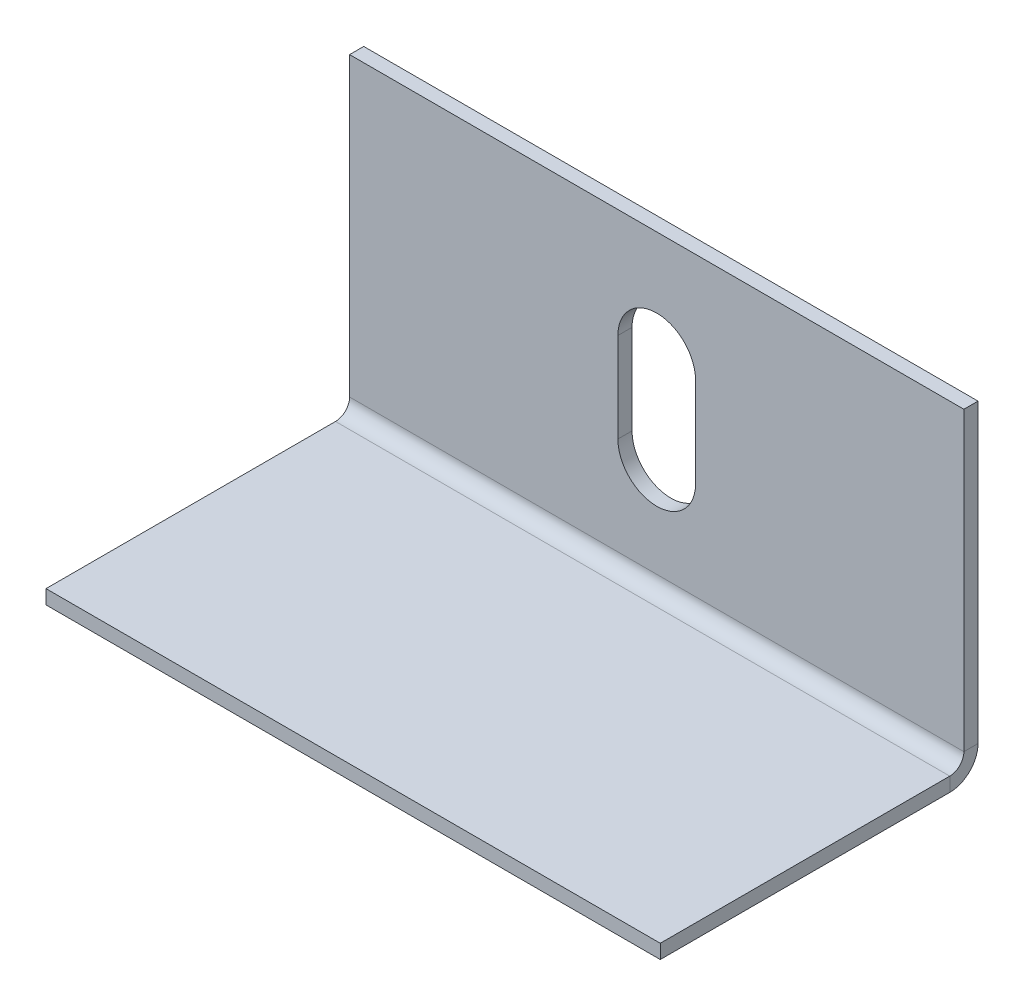
ISO-10303-21;
HEADER;
FILE_DESCRIPTION(('STEP AP214'),'2;1');
FILE_NAME('part.step','',(''),(''),'','','');
FILE_SCHEMA(('AUTOMOTIVE_DESIGN { 1 0 10303 214 1 1 1 1 }'));
ENDSEC;
DATA;
#1=APPLICATION_CONTEXT('core data for automotive mechanical design processes');
#2=APPLICATION_PROTOCOL_DEFINITION('international standard','automotive_design',2000,#1);
#3=PRODUCT_CONTEXT('',#1,'mechanical');
#4=PRODUCT('Part','Part','',(#3));
#5=PRODUCT_RELATED_PRODUCT_CATEGORY('part','',(#4));
#6=PRODUCT_DEFINITION_FORMATION('','',#4);
#7=PRODUCT_DEFINITION_CONTEXT('part definition',#1,'design');
#8=PRODUCT_DEFINITION('design','',#6,#7);
#9=PRODUCT_DEFINITION_SHAPE('','',#8);
#10=(LENGTH_UNIT() NAMED_UNIT(*) SI_UNIT(.MILLI.,.METRE.));
#11=(NAMED_UNIT(*) PLANE_ANGLE_UNIT() SI_UNIT($,.RADIAN.));
#12=(NAMED_UNIT(*) SI_UNIT($,.STERADIAN.) SOLID_ANGLE_UNIT());
#13=UNCERTAINTY_MEASURE_WITH_UNIT(LENGTH_MEASURE(1.E-05),#10,'distance_accuracy_value','');
#14=(GEOMETRIC_REPRESENTATION_CONTEXT(3) GLOBAL_UNCERTAINTY_ASSIGNED_CONTEXT((#13)) GLOBAL_UNIT_ASSIGNED_CONTEXT((#10,
#11,#12)) REPRESENTATION_CONTEXT('',''));
#15=CARTESIAN_POINT('',(0.,0.,0.));
#16=DIRECTION('',(0.,0.,1.));
#17=DIRECTION('',(1.,0.,0.));
#18=AXIS2_PLACEMENT_3D('',#15,#16,#17);
#19=CARTESIAN_POINT('',(-43.5,-2.,21.5));
#20=DIRECTION('',(-1.,0.,0.));
#21=DIRECTION('',(0.,0.,1.));
#22=AXIS2_PLACEMENT_3D('',#19,#20,#21);
#23=PLANE('',#22);
#24=DIRECTION('',(0.,0.,1.));
#25=VECTOR('',#24,1.);
#26=CARTESIAN_POINT('',(-43.5,0.,21.5));
#27=LINE('',#26,#25);
#28=CARTESIAN_POINT('',(-43.5,0.,-19.5));
#29=VERTEX_POINT('',#28);
#30=CARTESIAN_POINT('',(-43.5,0.,21.5));
#31=VERTEX_POINT('',#30);
#32=EDGE_CURVE('E221',#29,#31,#27,.T.);
#33=ORIENTED_EDGE('',*,*,#32,.F.);
#34=DIRECTION('',(0.,-1.,0.));
#35=VECTOR('',#34,1.);
#36=CARTESIAN_POINT('',(-43.5,0.,-19.5));
#37=LINE('',#36,#35);
#38=CARTESIAN_POINT('',(-43.5,-2.00000000000001,-19.5));
#39=VERTEX_POINT('',#38);
#40=EDGE_CURVE('E193',#29,#39,#37,.T.);
#41=ORIENTED_EDGE('',*,*,#40,.T.);
#42=DIRECTION('',(0.,0.,1.));
#43=VECTOR('',#42,1.);
#44=CARTESIAN_POINT('',(-43.5,-2.,21.5));
#45=LINE('',#44,#43);
#46=CARTESIAN_POINT('',(-43.5,-2.,21.5));
#47=VERTEX_POINT('',#46);
#48=EDGE_CURVE('E212',#39,#47,#45,.T.);
#49=ORIENTED_EDGE('',*,*,#48,.T.);
#50=DIRECTION('',(0.,1.,0.));
#51=VECTOR('',#50,1.);
#52=CARTESIAN_POINT('',(-43.5,-2.,21.5));
#53=LINE('',#52,#51);
#54=EDGE_CURVE('E218',#47,#31,#53,.T.);
#55=ORIENTED_EDGE('',*,*,#54,.T.);
#56=EDGE_LOOP('',(#33,#41,#49,#55));
#57=FACE_BOUND('',#56,.T.);
#58=ADVANCED_FACE('F39',(#57),#23,.T.);
#59=CARTESIAN_POINT('',(0.,-2.,0.));
#60=DIRECTION('',(0.,-1.,0.));
#61=DIRECTION('',(0.,0.,-1.));
#62=AXIS2_PLACEMENT_3D('',#59,#60,#61);
#63=PLANE('',#62);
#64=ORIENTED_EDGE('',*,*,#48,.F.);
#65=DIRECTION('',(-1.,0.,0.));
#66=VECTOR('',#65,1.);
#67=CARTESIAN_POINT('',(-43.5,-2.00000000000001,-19.5));
#68=LINE('',#67,#66);
#69=CARTESIAN_POINT('',(43.5,-2.,-19.5));
#70=VERTEX_POINT('',#69);
#71=EDGE_CURVE('E186',#39,#70,#68,.F.);
#72=ORIENTED_EDGE('',*,*,#71,.T.);
#73=DIRECTION('',(0.,0.,-1.));
#74=VECTOR('',#73,1.);
#75=CARTESIAN_POINT('',(43.5,-2.,21.5));
#76=LINE('',#75,#74);
#77=CARTESIAN_POINT('',(43.5,-2.,21.5));
#78=VERTEX_POINT('',#77);
#79=EDGE_CURVE('E209',#78,#70,#76,.T.);
#80=ORIENTED_EDGE('',*,*,#79,.F.);
#81=DIRECTION('',(1.,0.,0.));
#82=VECTOR('',#81,1.);
#83=CARTESIAN_POINT('',(-43.5,-2.,21.5));
#84=LINE('',#83,#82);
#85=EDGE_CURVE('E215',#47,#78,#84,.T.);
#86=ORIENTED_EDGE('',*,*,#85,.F.);
#87=EDGE_LOOP('',(#64,#72,#80,#86));
#88=FACE_BOUND('',#87,.T.);
#89=ADVANCED_FACE('F253',(#88),#63,.T.);
#90=CARTESIAN_POINT('',(0.,0.,0.));
#91=DIRECTION('',(0.,-1.,0.));
#92=DIRECTION('',(0.,0.,-1.));
#93=AXIS2_PLACEMENT_3D('',#90,#91,#92);
#94=PLANE('',#93);
#95=DIRECTION('',(-1.,0.,0.));
#96=VECTOR('',#95,1.);
#97=CARTESIAN_POINT('',(-43.5,0.,-19.5));
#98=LINE('',#97,#96);
#99=CARTESIAN_POINT('',(43.5,0.,-19.5));
#100=VERTEX_POINT('',#99);
#101=EDGE_CURVE('E199',#29,#100,#98,.F.);
#102=ORIENTED_EDGE('',*,*,#101,.F.);
#103=ORIENTED_EDGE('',*,*,#32,.T.);
#104=DIRECTION('',(1.,0.,0.));
#105=VECTOR('',#104,1.);
#106=CARTESIAN_POINT('',(-43.5,0.,21.5));
#107=LINE('',#106,#105);
#108=CARTESIAN_POINT('',(43.5,0.,21.5));
#109=VERTEX_POINT('',#108);
#110=EDGE_CURVE('E213',#31,#109,#107,.T.);
#111=ORIENTED_EDGE('',*,*,#110,.T.);
#112=DIRECTION('',(0.,0.,-1.));
#113=VECTOR('',#112,1.);
#114=CARTESIAN_POINT('',(43.5,0.,21.5));
#115=LINE('',#114,#113);
#116=EDGE_CURVE('E206',#109,#100,#115,.T.);
#117=ORIENTED_EDGE('',*,*,#116,.T.);
#118=EDGE_LOOP('',(#102,#103,#111,#117));
#119=FACE_BOUND('',#118,.T.);
#120=ADVANCED_FACE('F258',(#119),#94,.F.);
#121=CARTESIAN_POINT('',(43.5,-2.,21.5));
#122=DIRECTION('',(1.,0.,0.));
#123=DIRECTION('',(0.,0.,-1.));
#124=AXIS2_PLACEMENT_3D('',#121,#122,#123);
#125=PLANE('',#124);
#126=DIRECTION('',(0.,-1.,0.));
#127=VECTOR('',#126,1.);
#128=CARTESIAN_POINT('',(43.5,0.,-19.5));
#129=LINE('',#128,#127);
#130=EDGE_CURVE('E203',#100,#70,#129,.T.);
#131=ORIENTED_EDGE('',*,*,#130,.F.);
#132=ORIENTED_EDGE('',*,*,#116,.F.);
#133=DIRECTION('',(0.,1.,0.));
#134=VECTOR('',#133,1.);
#135=CARTESIAN_POINT('',(43.5,-2.,21.5));
#136=LINE('',#135,#134);
#137=EDGE_CURVE('E225',#78,#109,#136,.T.);
#138=ORIENTED_EDGE('',*,*,#137,.F.);
#139=ORIENTED_EDGE('',*,*,#79,.T.);
#140=EDGE_LOOP('',(#131,#132,#138,#139));
#141=FACE_BOUND('',#140,.T.);
#142=ADVANCED_FACE('F41',(#141),#125,.T.);
#143=CARTESIAN_POINT('',(-43.5,-2.,21.5));
#144=DIRECTION('',(0.,0.,1.));
#145=DIRECTION('',(1.,0.,0.));
#146=AXIS2_PLACEMENT_3D('',#143,#144,#145);
#147=PLANE('',#146);
#148=ORIENTED_EDGE('',*,*,#110,.F.);
#149=ORIENTED_EDGE('',*,*,#54,.F.);
#150=ORIENTED_EDGE('',*,*,#85,.T.);
#151=ORIENTED_EDGE('',*,*,#137,.T.);
#152=EDGE_LOOP('',(#148,#149,#150,#151));
#153=FACE_BOUND('',#152,.T.);
#154=ADVANCED_FACE('F263',(#153),#147,.T.);
#155=CARTESIAN_POINT('',(43.5,1.99999999999998,-19.5));
#156=DIRECTION('',(1.,0.,0.));
#157=DIRECTION('',(0.,1.,0.));
#158=AXIS2_PLACEMENT_3D('',#155,#156,#157);
#159=PLANE('',#158);
#160=DIRECTION('',(0.,0.,-1.));
#161=VECTOR('',#160,1.);
#162=CARTESIAN_POINT('',(43.5,1.99999999999999,-21.5));
#163=LINE('',#162,#161);
#164=CARTESIAN_POINT('',(43.5,1.99999999999997,-21.5));
#165=VERTEX_POINT('',#164);
#166=CARTESIAN_POINT('',(43.5,1.99999999999996,-23.5));
#167=VERTEX_POINT('',#166);
#168=EDGE_CURVE('E153',#165,#167,#163,.T.);
#169=ORIENTED_EDGE('',*,*,#168,.F.);
#170=CARTESIAN_POINT('',(43.5,1.99999999999998,-19.5));
#171=DIRECTION('',(-1.,0.,0.));
#172=DIRECTION('',(0.,-1.,0.));
#173=AXIS2_PLACEMENT_3D('',#170,#171,#172);
#174=CIRCLE('',#173,2.);
#175=EDGE_CURVE('E196',#100,#165,#174,.F.);
#176=ORIENTED_EDGE('',*,*,#175,.F.);
#177=ORIENTED_EDGE('',*,*,#130,.T.);
#178=CARTESIAN_POINT('',(43.5,1.99999999999998,-19.5));
#179=DIRECTION('',(-1.,0.,0.));
#180=DIRECTION('',(0.,-1.,0.));
#181=AXIS2_PLACEMENT_3D('',#178,#179,#180);
#182=CIRCLE('',#181,4.);
#183=EDGE_CURVE('E189',#70,#167,#182,.F.);
#184=ORIENTED_EDGE('',*,*,#183,.T.);
#185=EDGE_LOOP('',(#169,#176,#177,#184));
#186=FACE_BOUND('',#185,.T.);
#187=ADVANCED_FACE('F266',(#186),#159,.T.);
#188=CARTESIAN_POINT('',(-43.5,1.99999999999999,-19.5));
#189=DIRECTION('',(1.,0.,0.));
#190=DIRECTION('',(0.,1.,0.));
#191=AXIS2_PLACEMENT_3D('',#188,#189,#190);
#192=PLANE('',#191);
#193=CARTESIAN_POINT('',(-43.5,1.99999999999999,-19.5));
#194=DIRECTION('',(-1.,0.,0.));
#195=DIRECTION('',(0.,-1.,0.));
#196=AXIS2_PLACEMENT_3D('',#193,#194,#195);
#197=CIRCLE('',#196,2.);
#198=CARTESIAN_POINT('',(-43.5,1.99999999999998,-21.5));
#199=VERTEX_POINT('',#198);
#200=EDGE_CURVE('E185',#199,#29,#197,.T.);
#201=ORIENTED_EDGE('',*,*,#200,.F.);
#202=DIRECTION('',(0.,0.,-1.));
#203=VECTOR('',#202,1.);
#204=CARTESIAN_POINT('',(-43.5,2.,-21.5));
#205=LINE('',#204,#203);
#206=CARTESIAN_POINT('',(-43.5,2.00000000000001,-23.5));
#207=VERTEX_POINT('',#206);
#208=EDGE_CURVE('E158',#199,#207,#205,.T.);
#209=ORIENTED_EDGE('',*,*,#208,.T.);
#210=CARTESIAN_POINT('',(-43.5,1.99999999999999,-19.5));
#211=DIRECTION('',(-1.,0.,0.));
#212=DIRECTION('',(0.,-1.,0.));
#213=AXIS2_PLACEMENT_3D('',#210,#211,#212);
#214=CIRCLE('',#213,4.);
#215=EDGE_CURVE('E190',#207,#39,#214,.T.);
#216=ORIENTED_EDGE('',*,*,#215,.T.);
#217=ORIENTED_EDGE('',*,*,#40,.F.);
#218=EDGE_LOOP('',(#201,#209,#216,#217));
#219=FACE_BOUND('',#218,.T.);
#220=ADVANCED_FACE('F271',(#219),#192,.F.);
#221=CARTESIAN_POINT('',(-43.5,1.99999999999999,-19.5));
#222=DIRECTION('',(-1.,0.,0.));
#223=DIRECTION('',(0.,0.,-1.));
#224=AXIS2_PLACEMENT_3D('',#221,#222,#223);
#225=CYLINDRICAL_SURFACE('',#224,4.);
#226=ORIENTED_EDGE('',*,*,#71,.F.);
#227=ORIENTED_EDGE('',*,*,#215,.F.);
#228=DIRECTION('',(1.,0.,0.));
#229=VECTOR('',#228,1.);
#230=CARTESIAN_POINT('',(0.,2.00000000000001,-23.5));
#231=LINE('',#230,#229);
#232=EDGE_CURVE('E161',#207,#167,#231,.T.);
#233=ORIENTED_EDGE('',*,*,#232,.T.);
#234=ORIENTED_EDGE('',*,*,#183,.F.);
#235=EDGE_LOOP('',(#226,#227,#233,#234));
#236=FACE_BOUND('',#235,.T.);
#237=ADVANCED_FACE('F274',(#236),#225,.T.);
#238=CARTESIAN_POINT('',(-43.5,1.99999999999999,-19.5));
#239=DIRECTION('',(-1.,0.,0.));
#240=DIRECTION('',(0.,0.,-1.));
#241=AXIS2_PLACEMENT_3D('',#238,#239,#240);
#242=CYLINDRICAL_SURFACE('',#241,2.);
#243=ORIENTED_EDGE('',*,*,#101,.T.);
#244=ORIENTED_EDGE('',*,*,#175,.T.);
#245=DIRECTION('',(-1.,0.,0.));
#246=VECTOR('',#245,1.);
#247=CARTESIAN_POINT('',(43.5,1.99999999999999,-21.5));
#248=LINE('',#247,#246);
#249=EDGE_CURVE('E156',#165,#199,#248,.T.);
#250=ORIENTED_EDGE('',*,*,#249,.T.);
#251=ORIENTED_EDGE('',*,*,#200,.T.);
#252=EDGE_LOOP('',(#243,#244,#250,#251));
#253=FACE_BOUND('',#252,.T.);
#254=ADVANCED_FACE('F279',(#253),#242,.F.);
#255=CARTESIAN_POINT('',(43.5,0.,-23.5));
#256=DIRECTION('',(-1.,0.,0.));
#257=DIRECTION('',(0.,0.,1.));
#258=AXIS2_PLACEMENT_3D('',#255,#256,#257);
#259=PLANE('',#258);
#260=ORIENTED_EDGE('',*,*,#168,.T.);
#261=DIRECTION('',(0.,-1.,0.));
#262=VECTOR('',#261,1.);
#263=CARTESIAN_POINT('',(43.5,0.,-23.5));
#264=LINE('',#263,#262);
#265=CARTESIAN_POINT('',(43.5,44.,-23.5000000000001));
#266=VERTEX_POINT('',#265);
#267=EDGE_CURVE('E166',#266,#167,#264,.T.);
#268=ORIENTED_EDGE('',*,*,#267,.F.);
#269=DIRECTION('',(0.,0.,1.));
#270=VECTOR('',#269,1.);
#271=CARTESIAN_POINT('',(43.5,44.,-23.5000000000001));
#272=LINE('',#271,#270);
#273=CARTESIAN_POINT('',(43.5,44.,-21.5000000000001));
#274=VERTEX_POINT('',#273);
#275=EDGE_CURVE('E174',#266,#274,#272,.T.);
#276=ORIENTED_EDGE('',*,*,#275,.T.);
#277=DIRECTION('',(0.,-1.,0.));
#278=VECTOR('',#277,1.);
#279=CARTESIAN_POINT('',(43.5,0.,-21.5));
#280=LINE('',#279,#278);
#281=EDGE_CURVE('E165',#274,#165,#280,.T.);
#282=ORIENTED_EDGE('',*,*,#281,.T.);
#283=EDGE_LOOP('',(#260,#268,#276,#282));
#284=FACE_BOUND('',#283,.T.);
#285=ADVANCED_FACE('F282',(#284),#259,.F.);
#286=CARTESIAN_POINT('',(-43.5,44.,-23.5000000000001));
#287=DIRECTION('',(1.,0.,0.));
#288=DIRECTION('',(0.,0.,-1.));
#289=AXIS2_PLACEMENT_3D('',#286,#287,#288);
#290=PLANE('',#289);
#291=ORIENTED_EDGE('',*,*,#208,.F.);
#292=DIRECTION('',(0.,1.,0.));
#293=VECTOR('',#292,1.);
#294=CARTESIAN_POINT('',(-43.5,44.,-21.5000000000001));
#295=LINE('',#294,#293);
#296=CARTESIAN_POINT('',(-43.5,44.,-21.5000000000001));
#297=VERTEX_POINT('',#296);
#298=EDGE_CURVE('E177',#199,#297,#295,.T.);
#299=ORIENTED_EDGE('',*,*,#298,.T.);
#300=DIRECTION('',(0.,0.,1.));
#301=VECTOR('',#300,1.);
#302=CARTESIAN_POINT('',(-43.5,44.,-23.5000000000001));
#303=LINE('',#302,#301);
#304=CARTESIAN_POINT('',(-43.5,44.,-23.5000000000001));
#305=VERTEX_POINT('',#304);
#306=EDGE_CURVE('E182',#305,#297,#303,.T.);
#307=ORIENTED_EDGE('',*,*,#306,.F.);
#308=DIRECTION('',(0.,1.,0.));
#309=VECTOR('',#308,1.);
#310=CARTESIAN_POINT('',(-43.5,44.,-23.5000000000001));
#311=LINE('',#310,#309);
#312=EDGE_CURVE('E169',#207,#305,#311,.T.);
#313=ORIENTED_EDGE('',*,*,#312,.F.);
#314=EDGE_LOOP('',(#291,#299,#307,#313));
#315=FACE_BOUND('',#314,.T.);
#316=ADVANCED_FACE('F289',(#315),#290,.F.);
#317=CARTESIAN_POINT('',(0.,0.,-23.5));
#318=DIRECTION('',(0.,0.,1.));
#319=DIRECTION('',(0.,-1.,0.));
#320=AXIS2_PLACEMENT_3D('',#317,#318,#319);
#321=PLANE('',#320);
#322=DIRECTION('',(0.,-1.,0.));
#323=VECTOR('',#322,1.);
#324=CARTESIAN_POINT('',(5.5,28.5486665457029,-23.5000000000001));
#325=LINE('',#324,#323);
#326=CARTESIAN_POINT('',(5.5,28.5486665457029,-23.5000000000001));
#327=VERTEX_POINT('',#326);
#328=CARTESIAN_POINT('',(5.5,15.8486665457029,-23.5));
#329=VERTEX_POINT('',#328);
#330=EDGE_CURVE('E139',#327,#329,#325,.T.);
#331=ORIENTED_EDGE('',*,*,#330,.F.);
#332=CARTESIAN_POINT('',(0.,28.5486665457029,-23.5000000000001));
#333=DIRECTION('',(0.,0.,-1.));
#334=DIRECTION('',(0.,1.,0.));
#335=AXIS2_PLACEMENT_3D('',#332,#333,#334);
#336=CIRCLE('',#335,5.5);
#337=CARTESIAN_POINT('',(-5.5,28.5486665457029,-23.5000000000001));
#338=VERTEX_POINT('',#337);
#339=EDGE_CURVE('E54',#338,#327,#336,.T.);
#340=ORIENTED_EDGE('',*,*,#339,.F.);
#341=DIRECTION('',(0.,1.,0.));
#342=VECTOR('',#341,1.);
#343=CARTESIAN_POINT('',(-5.5,28.5486665457029,-23.5000000000001));
#344=LINE('',#343,#342);
#345=CARTESIAN_POINT('',(-5.5,15.8486665457029,-23.5));
#346=VERTEX_POINT('',#345);
#347=EDGE_CURVE('E146',#346,#338,#344,.T.);
#348=ORIENTED_EDGE('',*,*,#347,.F.);
#349=CARTESIAN_POINT('',(0.,15.8486665457029,-23.5));
#350=DIRECTION('',(0.,0.,-1.));
#351=DIRECTION('',(0.,1.,0.));
#352=AXIS2_PLACEMENT_3D('',#349,#350,#351);
#353=CIRCLE('',#352,5.5);
#354=EDGE_CURVE('E130',#329,#346,#353,.T.);
#355=ORIENTED_EDGE('',*,*,#354,.F.);
#356=EDGE_LOOP('',(#331,#340,#348,#355));
#357=FACE_BOUND('',#356,.T.);
#358=ORIENTED_EDGE('',*,*,#232,.F.);
#359=ORIENTED_EDGE('',*,*,#312,.T.);
#360=DIRECTION('',(1.,0.,0.));
#361=VECTOR('',#360,1.);
#362=CARTESIAN_POINT('',(43.5,44.,-23.5000000000001));
#363=LINE('',#362,#361);
#364=EDGE_CURVE('E172',#305,#266,#363,.T.);
#365=ORIENTED_EDGE('',*,*,#364,.T.);
#366=ORIENTED_EDGE('',*,*,#267,.T.);
#367=EDGE_LOOP('',(#358,#359,#365,#366));
#368=FACE_BOUND('',#367,.T.);
#369=ADVANCED_FACE('F143',(#357,#368),#321,.F.);
#370=CARTESIAN_POINT('',(0.,0.,-21.5));
#371=DIRECTION('',(0.,0.,1.));
#372=DIRECTION('',(0.,-1.,0.));
#373=AXIS2_PLACEMENT_3D('',#370,#371,#372);
#374=PLANE('',#373);
#375=CARTESIAN_POINT('',(0.,28.5486665457029,-21.5000000000001));
#376=DIRECTION('',(0.,0.,1.));
#377=DIRECTION('',(0.,-1.,0.));
#378=AXIS2_PLACEMENT_3D('',#375,#376,#377);
#379=CIRCLE('',#378,5.5);
#380=CARTESIAN_POINT('',(5.5,28.5486665457029,-21.5000000000001));
#381=VERTEX_POINT('',#380);
#382=CARTESIAN_POINT('',(-5.5,28.5486665457029,-21.5000000000001));
#383=VERTEX_POINT('',#382);
#384=EDGE_CURVE('E11',#381,#383,#379,.T.);
#385=ORIENTED_EDGE('',*,*,#384,.F.);
#386=DIRECTION('',(0.,1.,0.));
#387=VECTOR('',#386,1.);
#388=CARTESIAN_POINT('',(5.5,0.,-21.5));
#389=LINE('',#388,#387);
#390=CARTESIAN_POINT('',(5.5,15.8486665457029,-21.5));
#391=VERTEX_POINT('',#390);
#392=EDGE_CURVE('E227',#391,#381,#389,.T.);
#393=ORIENTED_EDGE('',*,*,#392,.F.);
#394=CARTESIAN_POINT('',(0.,15.8486665457029,-21.5));
#395=DIRECTION('',(0.,0.,1.));
#396=DIRECTION('',(0.,-1.,0.));
#397=AXIS2_PLACEMENT_3D('',#394,#395,#396);
#398=CIRCLE('',#397,5.5);
#399=CARTESIAN_POINT('',(-5.5,15.8486665457029,-21.5));
#400=VERTEX_POINT('',#399);
#401=EDGE_CURVE('E133',#400,#391,#398,.T.);
#402=ORIENTED_EDGE('',*,*,#401,.F.);
#403=DIRECTION('',(0.,-1.,0.));
#404=VECTOR('',#403,1.);
#405=CARTESIAN_POINT('',(-5.5,0.,-21.5));
#406=LINE('',#405,#404);
#407=EDGE_CURVE('E47',#383,#400,#406,.T.);
#408=ORIENTED_EDGE('',*,*,#407,.F.);
#409=EDGE_LOOP('',(#385,#393,#402,#408));
#410=FACE_BOUND('',#409,.T.);
#411=ORIENTED_EDGE('',*,*,#298,.F.);
#412=ORIENTED_EDGE('',*,*,#249,.F.);
#413=ORIENTED_EDGE('',*,*,#281,.F.);
#414=DIRECTION('',(1.,0.,0.));
#415=VECTOR('',#414,1.);
#416=CARTESIAN_POINT('',(43.5,44.,-21.5000000000001));
#417=LINE('',#416,#415);
#418=EDGE_CURVE('E170',#297,#274,#417,.T.);
#419=ORIENTED_EDGE('',*,*,#418,.F.);
#420=EDGE_LOOP('',(#411,#412,#413,#419));
#421=FACE_BOUND('',#420,.T.);
#422=ADVANCED_FACE('F237',(#410,#421),#374,.T.);
#423=CARTESIAN_POINT('',(43.5,44.,-23.5000000000001));
#424=DIRECTION('',(0.,-1.,0.));
#425=DIRECTION('',(0.,0.,-1.));
#426=AXIS2_PLACEMENT_3D('',#423,#424,#425);
#427=PLANE('',#426);
#428=ORIENTED_EDGE('',*,*,#418,.T.);
#429=ORIENTED_EDGE('',*,*,#275,.F.);
#430=ORIENTED_EDGE('',*,*,#364,.F.);
#431=ORIENTED_EDGE('',*,*,#306,.T.);
#432=EDGE_LOOP('',(#428,#429,#430,#431));
#433=FACE_BOUND('',#432,.T.);
#434=ADVANCED_FACE('F241',(#433),#427,.F.);
#435=CARTESIAN_POINT('',(0.,28.5486665457029,-13.5000000000001));
#436=DIRECTION('',(0.,0.,-1.));
#437=DIRECTION('',(0.,1.,0.));
#438=AXIS2_PLACEMENT_3D('',#435,#436,#437);
#439=CYLINDRICAL_SURFACE('',#438,5.5);
#440=ORIENTED_EDGE('',*,*,#384,.T.);
#441=DIRECTION('',(0.,0.,-1.));
#442=VECTOR('',#441,1.);
#443=CARTESIAN_POINT('',(-5.5,28.5486665457029,-13.5000000000001));
#444=LINE('',#443,#442);
#445=EDGE_CURVE('E151',#383,#338,#444,.T.);
#446=ORIENTED_EDGE('',*,*,#445,.T.);
#447=ORIENTED_EDGE('',*,*,#339,.T.);
#448=DIRECTION('',(0.,0.,-1.));
#449=VECTOR('',#448,1.);
#450=CARTESIAN_POINT('',(5.5,28.5486665457029,-13.5000000000001));
#451=LINE('',#450,#449);
#452=EDGE_CURVE('E136',#381,#327,#451,.T.);
#453=ORIENTED_EDGE('',*,*,#452,.F.);
#454=EDGE_LOOP('',(#440,#446,#447,#453));
#455=FACE_BOUND('',#454,.T.);
#456=ADVANCED_FACE('F239',(#455),#439,.F.);
#457=CARTESIAN_POINT('',(-5.5,28.5486665457029,-13.5000000000001));
#458=DIRECTION('',(-1.,0.,0.));
#459=DIRECTION('',(0.,-1.,0.));
#460=AXIS2_PLACEMENT_3D('',#457,#458,#459);
#461=PLANE('',#460);
#462=ORIENTED_EDGE('',*,*,#407,.T.);
#463=DIRECTION('',(0.,0.,-1.));
#464=VECTOR('',#463,1.);
#465=CARTESIAN_POINT('',(-5.5,15.8486665457029,-13.5));
#466=LINE('',#465,#464);
#467=EDGE_CURVE('E135',#400,#346,#466,.T.);
#468=ORIENTED_EDGE('',*,*,#467,.T.);
#469=ORIENTED_EDGE('',*,*,#347,.T.);
#470=ORIENTED_EDGE('',*,*,#445,.F.);
#471=EDGE_LOOP('',(#462,#468,#469,#470));
#472=FACE_BOUND('',#471,.T.);
#473=ADVANCED_FACE('F234',(#472),#461,.F.);
#474=CARTESIAN_POINT('',(0.,15.8486665457029,-13.5));
#475=DIRECTION('',(0.,0.,-1.));
#476=DIRECTION('',(0.,1.,0.));
#477=AXIS2_PLACEMENT_3D('',#474,#475,#476);
#478=CYLINDRICAL_SURFACE('',#477,5.5);
#479=ORIENTED_EDGE('',*,*,#401,.T.);
#480=DIRECTION('',(0.,0.,-1.));
#481=VECTOR('',#480,1.);
#482=CARTESIAN_POINT('',(5.5,15.8486665457029,-13.5));
#483=LINE('',#482,#481);
#484=EDGE_CURVE('E62',#391,#329,#483,.T.);
#485=ORIENTED_EDGE('',*,*,#484,.T.);
#486=ORIENTED_EDGE('',*,*,#354,.T.);
#487=ORIENTED_EDGE('',*,*,#467,.F.);
#488=EDGE_LOOP('',(#479,#485,#486,#487));
#489=FACE_BOUND('',#488,.T.);
#490=ADVANCED_FACE('F127',(#489),#478,.F.);
#491=CARTESIAN_POINT('',(5.5,28.5486665457029,-13.5000000000001));
#492=DIRECTION('',(1.,0.,0.));
#493=DIRECTION('',(0.,1.,0.));
#494=AXIS2_PLACEMENT_3D('',#491,#492,#493);
#495=PLANE('',#494);
#496=ORIENTED_EDGE('',*,*,#392,.T.);
#497=ORIENTED_EDGE('',*,*,#452,.T.);
#498=ORIENTED_EDGE('',*,*,#330,.T.);
#499=ORIENTED_EDGE('',*,*,#484,.F.);
#500=EDGE_LOOP('',(#496,#497,#498,#499));
#501=FACE_BOUND('',#500,.T.);
#502=ADVANCED_FACE('F140',(#501),#495,.F.);
#503=CLOSED_SHELL('',(#58,#89,#120,#142,#154,#187,#220,#237,#254,#285,#316,#369,#422,#434,#456,
#473,#490,#502));
#504=MANIFOLD_SOLID_BREP('B2',#503);
#505=ADVANCED_BREP_SHAPE_REPRESENTATION('',(#18,#504),#14);
#506=SHAPE_DEFINITION_REPRESENTATION(#9,#505);
ENDSEC;
END-ISO-10303-21;
